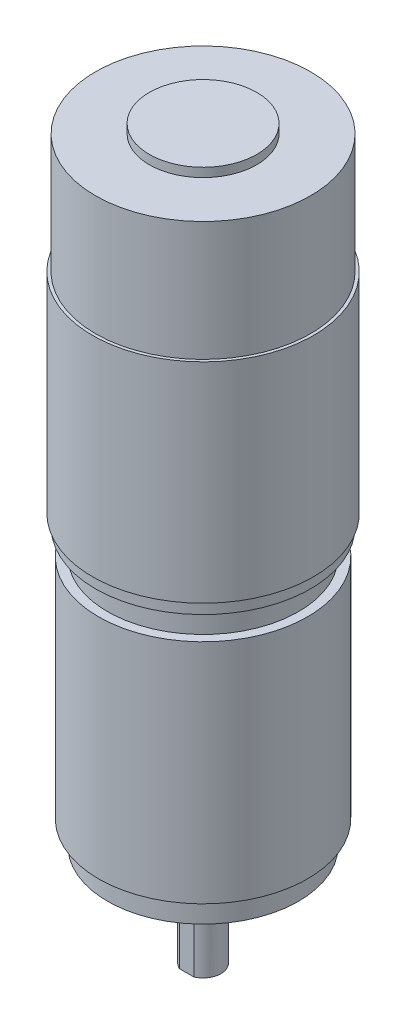
ISO-10303-21;
HEADER;
FILE_DESCRIPTION(('STEP AP214'),'2;1');
FILE_NAME('part.step','',(''),(''),'','','');
FILE_SCHEMA(('AUTOMOTIVE_DESIGN { 1 0 10303 214 1 1 1 1 }'));
ENDSEC;
DATA;
#1=APPLICATION_CONTEXT('core data for automotive mechanical design processes');
#2=APPLICATION_PROTOCOL_DEFINITION('international standard','automotive_design',2000,#1);
#3=PRODUCT_CONTEXT('',#1,'mechanical');
#4=PRODUCT('Part','Part','',(#3));
#5=PRODUCT_RELATED_PRODUCT_CATEGORY('part','',(#4));
#6=PRODUCT_DEFINITION_FORMATION('','',#4);
#7=PRODUCT_DEFINITION_CONTEXT('part definition',#1,'design');
#8=PRODUCT_DEFINITION('design','',#6,#7);
#9=PRODUCT_DEFINITION_SHAPE('','',#8);
#10=(LENGTH_UNIT() NAMED_UNIT(*) SI_UNIT(.MILLI.,.METRE.));
#11=(NAMED_UNIT(*) PLANE_ANGLE_UNIT() SI_UNIT($,.RADIAN.));
#12=(NAMED_UNIT(*) SI_UNIT($,.STERADIAN.) SOLID_ANGLE_UNIT());
#13=UNCERTAINTY_MEASURE_WITH_UNIT(LENGTH_MEASURE(1.E-05),#10,'distance_accuracy_value','');
#14=(GEOMETRIC_REPRESENTATION_CONTEXT(3) GLOBAL_UNCERTAINTY_ASSIGNED_CONTEXT((#13)) GLOBAL_UNIT_ASSIGNED_CONTEXT((#10,
#11,#12)) REPRESENTATION_CONTEXT('',''));
#15=CARTESIAN_POINT('',(0.,0.,0.));
#16=DIRECTION('',(0.,0.,1.));
#17=DIRECTION('',(1.,0.,0.));
#18=AXIS2_PLACEMENT_3D('',#15,#16,#17);
#19=CARTESIAN_POINT('',(-2.99999999999999,-121.8,0.));
#20=DIRECTION('',(0.,1.,0.));
#21=DIRECTION('',(0.,0.,1.));
#22=AXIS2_PLACEMENT_3D('',#19,#20,#21);
#23=PLANE('',#22);
#24=DIRECTION('',(1.,0.,0.));
#25=VECTOR('',#24,1.);
#26=CARTESIAN_POINT('',(-2.99999999999999,-121.8,-2.75));
#27=LINE('',#26,#25);
#28=CARTESIAN_POINT('',(-1.19895788082815,-121.8,-2.75));
#29=VERTEX_POINT('',#28);
#30=CARTESIAN_POINT('',(1.19895788082815,-121.8,-2.75));
#31=VERTEX_POINT('',#30);
#32=EDGE_CURVE('E94',#29,#31,#27,.T.);
#33=ORIENTED_EDGE('',*,*,#32,.T.);
#34=CARTESIAN_POINT('',(0.,-121.8,0.));
#35=DIRECTION('',(0.,-1.,0.));
#36=DIRECTION('',(0.,0.,-1.));
#37=AXIS2_PLACEMENT_3D('',#34,#35,#36);
#38=CIRCLE('',#37,2.99999999999999);
#39=CARTESIAN_POINT('',(1.19895788082815,-121.8,2.75));
#40=VERTEX_POINT('',#39);
#41=EDGE_CURVE('E60',#31,#40,#38,.T.);
#42=ORIENTED_EDGE('',*,*,#41,.T.);
#43=DIRECTION('',(-1.,0.,0.));
#44=VECTOR('',#43,1.);
#45=CARTESIAN_POINT('',(-2.99999999999999,-121.8,2.75));
#46=LINE('',#45,#44);
#47=CARTESIAN_POINT('',(-1.19895788082815,-121.8,2.75));
#48=VERTEX_POINT('',#47);
#49=EDGE_CURVE('E83',#40,#48,#46,.T.);
#50=ORIENTED_EDGE('',*,*,#49,.T.);
#51=EDGE_CURVE('E55',#48,#29,#38,.T.);
#52=ORIENTED_EDGE('',*,*,#51,.T.);
#53=EDGE_LOOP('',(#33,#42,#50,#52));
#54=FACE_BOUND('',#53,.T.);
#55=ADVANCED_FACE('F40',(#54),#23,.F.);
#56=CARTESIAN_POINT('',(0.,-180.909291234387,0.));
#57=DIRECTION('',(0.,-1.,0.));
#58=DIRECTION('',(0.,0.,-1.));
#59=AXIS2_PLACEMENT_3D('',#56,#57,#58);
#60=CYLINDRICAL_SURFACE('',#59,2.99999999999999);
#61=DIRECTION('',(0.,-1.,0.));
#62=VECTOR('',#61,1.);
#63=CARTESIAN_POINT('',(1.19895788082815,-180.909291234387,2.75));
#64=LINE('',#63,#62);
#65=CARTESIAN_POINT('',(1.19895788082815,-109.8,2.75));
#66=VERTEX_POINT('',#65);
#67=EDGE_CURVE('E106',#40,#66,#64,.F.);
#68=ORIENTED_EDGE('',*,*,#67,.F.);
#69=ORIENTED_EDGE('',*,*,#41,.F.);
#70=DIRECTION('',(0.,-1.,0.));
#71=VECTOR('',#70,1.);
#72=CARTESIAN_POINT('',(1.19895788082815,-180.909291234387,-2.75));
#73=LINE('',#72,#71);
#74=CARTESIAN_POINT('',(1.19895788082815,-109.8,-2.75));
#75=VERTEX_POINT('',#74);
#76=EDGE_CURVE('E12',#75,#31,#73,.T.);
#77=ORIENTED_EDGE('',*,*,#76,.F.);
#78=CARTESIAN_POINT('',(0.,-109.8,0.));
#79=DIRECTION('',(0.,-1.,0.));
#80=DIRECTION('',(0.,0.,-1.));
#81=AXIS2_PLACEMENT_3D('',#78,#79,#80);
#82=CIRCLE('',#81,2.99999999999999);
#83=CARTESIAN_POINT('',(-1.19895788082815,-109.8,-2.75));
#84=VERTEX_POINT('',#83);
#85=EDGE_CURVE('E48',#84,#75,#82,.T.);
#86=ORIENTED_EDGE('',*,*,#85,.F.);
#87=DIRECTION('',(0.,-1.,0.));
#88=VECTOR('',#87,1.);
#89=CARTESIAN_POINT('',(-1.19895788082815,-180.909291234387,-2.75));
#90=LINE('',#89,#88);
#91=EDGE_CURVE('E90',#29,#84,#90,.F.);
#92=ORIENTED_EDGE('',*,*,#91,.F.);
#93=ORIENTED_EDGE('',*,*,#51,.F.);
#94=DIRECTION('',(0.,-1.,0.));
#95=VECTOR('',#94,1.);
#96=CARTESIAN_POINT('',(-1.19895788082815,-180.909291234387,2.75));
#97=LINE('',#96,#95);
#98=CARTESIAN_POINT('',(-1.19895788082815,-109.8,2.75));
#99=VERTEX_POINT('',#98);
#100=EDGE_CURVE('E81',#99,#48,#97,.T.);
#101=ORIENTED_EDGE('',*,*,#100,.F.);
#102=EDGE_CURVE('E91',#66,#99,#82,.T.);
#103=ORIENTED_EDGE('',*,*,#102,.F.);
#104=EDGE_LOOP('',(#68,#69,#77,#86,#92,#93,#101,#103));
#105=FACE_BOUND('',#104,.T.);
#106=CARTESIAN_POINT('',(0.,-106.8,0.));
#107=DIRECTION('',(0.,-1.,0.));
#108=DIRECTION('',(0.,0.,-1.));
#109=AXIS2_PLACEMENT_3D('',#106,#107,#108);
#110=CIRCLE('',#109,2.99999999999999);
#111=CARTESIAN_POINT('',(0.,-106.8,-2.99999999999999));
#112=VERTEX_POINT('',#111);
#113=EDGE_CURVE('E102',#112,#112,#110,.T.);
#114=ORIENTED_EDGE('',*,*,#113,.T.);
#115=EDGE_LOOP('',(#114));
#116=FACE_BOUND('',#115,.T.);
#117=ADVANCED_FACE('F98',(#105,#116),#60,.T.);
#118=CARTESIAN_POINT('',(-10.,-106.8,0.));
#119=DIRECTION('',(0.,1.,0.));
#120=DIRECTION('',(0.,0.,1.));
#121=AXIS2_PLACEMENT_3D('',#118,#119,#120);
#122=PLANE('',#121);
#123=ORIENTED_EDGE('',*,*,#113,.F.);
#124=EDGE_LOOP('',(#123));
#125=FACE_BOUND('',#124,.T.);
#126=CARTESIAN_POINT('',(0.,-106.8,0.));
#127=DIRECTION('',(0.,-1.,0.));
#128=DIRECTION('',(0.,0.,-1.));
#129=AXIS2_PLACEMENT_3D('',#126,#127,#128);
#130=CIRCLE('',#129,10.);
#131=CARTESIAN_POINT('',(0.,-106.8,-10.));
#132=VERTEX_POINT('',#131);
#133=EDGE_CURVE('E108',#132,#132,#130,.T.);
#134=ORIENTED_EDGE('',*,*,#133,.T.);
#135=EDGE_LOOP('',(#134));
#136=FACE_BOUND('',#135,.T.);
#137=ADVANCED_FACE('F200',(#125,#136),#122,.F.);
#138=CARTESIAN_POINT('',(0.,-180.909291234387,0.));
#139=DIRECTION('',(0.,-1.,0.));
#140=DIRECTION('',(0.,0.,-1.));
#141=AXIS2_PLACEMENT_3D('',#138,#139,#140);
#142=CYLINDRICAL_SURFACE('',#141,10.);
#143=ORIENTED_EDGE('',*,*,#133,.F.);
#144=EDGE_LOOP('',(#143));
#145=FACE_BOUND('',#144,.T.);
#146=CARTESIAN_POINT('',(0.,-104.8,0.));
#147=DIRECTION('',(0.,-1.,0.));
#148=DIRECTION('',(0.,0.,-1.));
#149=AXIS2_PLACEMENT_3D('',#146,#147,#148);
#150=CIRCLE('',#149,10.);
#151=CARTESIAN_POINT('',(0.,-104.8,-10.));
#152=VERTEX_POINT('',#151);
#153=EDGE_CURVE('E193',#152,#152,#150,.T.);
#154=ORIENTED_EDGE('',*,*,#153,.T.);
#155=EDGE_LOOP('',(#154));
#156=FACE_BOUND('',#155,.T.);
#157=ADVANCED_FACE('F202',(#145,#156),#142,.T.);
#158=CARTESIAN_POINT('',(-16.,-104.8,0.));
#159=DIRECTION('',(0.,1.,0.));
#160=DIRECTION('',(0.,0.,1.));
#161=AXIS2_PLACEMENT_3D('',#158,#159,#160);
#162=PLANE('',#161);
#163=CARTESIAN_POINT('',(-9.,-104.8,-9.));
#164=DIRECTION('',(0.,-1.,0.));
#165=DIRECTION('',(0.,0.,-1.));
#166=AXIS2_PLACEMENT_3D('',#163,#164,#165);
#167=CIRCLE('',#166,1.5);
#168=CARTESIAN_POINT('',(-9.,-104.8,-10.5));
#169=VERTEX_POINT('',#168);
#170=EDGE_CURVE('E502',#169,#169,#167,.T.);
#171=ORIENTED_EDGE('',*,*,#170,.F.);
#172=EDGE_LOOP('',(#171));
#173=FACE_BOUND('',#172,.T.);
#174=CARTESIAN_POINT('',(9.,-104.8,-9.));
#175=DIRECTION('',(0.,-1.,0.));
#176=DIRECTION('',(0.,0.,-1.));
#177=AXIS2_PLACEMENT_3D('',#174,#175,#176);
#178=CIRCLE('',#177,1.5);
#179=CARTESIAN_POINT('',(9.,-104.8,-10.5));
#180=VERTEX_POINT('',#179);
#181=EDGE_CURVE('E501',#180,#180,#178,.T.);
#182=ORIENTED_EDGE('',*,*,#181,.F.);
#183=EDGE_LOOP('',(#182));
#184=FACE_BOUND('',#183,.T.);
#185=CARTESIAN_POINT('',(9.,-104.8,9.));
#186=DIRECTION('',(0.,-1.,0.));
#187=DIRECTION('',(0.,0.,-1.));
#188=AXIS2_PLACEMENT_3D('',#185,#186,#187);
#189=CIRCLE('',#188,1.5);
#190=CARTESIAN_POINT('',(9.,-104.8,7.5));
#191=VERTEX_POINT('',#190);
#192=EDGE_CURVE('E522',#191,#191,#189,.T.);
#193=ORIENTED_EDGE('',*,*,#192,.F.);
#194=EDGE_LOOP('',(#193));
#195=FACE_BOUND('',#194,.T.);
#196=CARTESIAN_POINT('',(-9.,-104.8,9.));
#197=DIRECTION('',(0.,-1.,0.));
#198=DIRECTION('',(0.,0.,-1.));
#199=AXIS2_PLACEMENT_3D('',#196,#197,#198);
#200=CIRCLE('',#199,1.5);
#201=CARTESIAN_POINT('',(-9.,-104.8,7.5));
#202=VERTEX_POINT('',#201);
#203=EDGE_CURVE('E135',#202,#202,#200,.T.);
#204=ORIENTED_EDGE('',*,*,#203,.F.);
#205=EDGE_LOOP('',(#204));
#206=FACE_BOUND('',#205,.T.);
#207=ORIENTED_EDGE('',*,*,#153,.F.);
#208=EDGE_LOOP('',(#207));
#209=FACE_BOUND('',#208,.T.);
#210=CARTESIAN_POINT('',(0.,-104.8,0.));
#211=DIRECTION('',(0.,-1.,0.));
#212=DIRECTION('',(0.,0.,-1.));
#213=AXIS2_PLACEMENT_3D('',#210,#211,#212);
#214=CIRCLE('',#213,16.);
#215=CARTESIAN_POINT('',(0.,-104.8,-16.));
#216=VERTEX_POINT('',#215);
#217=EDGE_CURVE('E189',#216,#216,#214,.T.);
#218=ORIENTED_EDGE('',*,*,#217,.T.);
#219=EDGE_LOOP('',(#218));
#220=FACE_BOUND('',#219,.T.);
#221=ADVANCED_FACE('F205',(#173,#184,#195,#206,#209,#220),#162,.F.);
#222=CARTESIAN_POINT('',(0.,-180.909291234387,0.));
#223=DIRECTION('',(0.,-1.,0.));
#224=DIRECTION('',(0.,0.,-1.));
#225=AXIS2_PLACEMENT_3D('',#222,#223,#224);
#226=CYLINDRICAL_SURFACE('',#225,16.);
#227=ORIENTED_EDGE('',*,*,#217,.F.);
#228=EDGE_LOOP('',(#227));
#229=FACE_BOUND('',#228,.T.);
#230=CARTESIAN_POINT('',(0.,-100.8,0.));
#231=DIRECTION('',(0.,-1.,0.));
#232=DIRECTION('',(0.,0.,-1.));
#233=AXIS2_PLACEMENT_3D('',#230,#231,#232);
#234=CIRCLE('',#233,16.);
#235=CARTESIAN_POINT('',(0.,-100.8,-16.));
#236=VERTEX_POINT('',#235);
#237=EDGE_CURVE('E185',#236,#236,#234,.T.);
#238=ORIENTED_EDGE('',*,*,#237,.T.);
#239=EDGE_LOOP('',(#238));
#240=FACE_BOUND('',#239,.T.);
#241=ADVANCED_FACE('F211',(#229,#240),#226,.T.);
#242=CARTESIAN_POINT('',(-17.5,-100.8,0.));
#243=DIRECTION('',(0.,1.,0.));
#244=DIRECTION('',(0.,0.,1.));
#245=AXIS2_PLACEMENT_3D('',#242,#243,#244);
#246=PLANE('',#245);
#247=ORIENTED_EDGE('',*,*,#237,.F.);
#248=EDGE_LOOP('',(#247));
#249=FACE_BOUND('',#248,.T.);
#250=CARTESIAN_POINT('',(0.,-100.8,0.));
#251=DIRECTION('',(0.,-1.,0.));
#252=DIRECTION('',(0.,0.,-1.));
#253=AXIS2_PLACEMENT_3D('',#250,#251,#252);
#254=CIRCLE('',#253,17.5);
#255=CARTESIAN_POINT('',(0.,-100.8,-17.5));
#256=VERTEX_POINT('',#255);
#257=EDGE_CURVE('E181',#256,#256,#254,.T.);
#258=ORIENTED_EDGE('',*,*,#257,.T.);
#259=EDGE_LOOP('',(#258));
#260=FACE_BOUND('',#259,.T.);
#261=ADVANCED_FACE('F218',(#249,#260),#246,.F.);
#262=CARTESIAN_POINT('',(0.,-180.909291234387,0.));
#263=DIRECTION('',(0.,-1.,0.));
#264=DIRECTION('',(0.,0.,-1.));
#265=AXIS2_PLACEMENT_3D('',#262,#263,#264);
#266=CYLINDRICAL_SURFACE('',#265,17.5);
#267=ORIENTED_EDGE('',*,*,#257,.F.);
#268=EDGE_LOOP('',(#267));
#269=FACE_BOUND('',#268,.T.);
#270=CARTESIAN_POINT('',(0.,-62.8,0.));
#271=DIRECTION('',(0.,-1.,0.));
#272=DIRECTION('',(0.,0.,-1.));
#273=AXIS2_PLACEMENT_3D('',#270,#271,#272);
#274=CIRCLE('',#273,17.5);
#275=CARTESIAN_POINT('',(0.,-62.8,-17.5));
#276=VERTEX_POINT('',#275);
#277=EDGE_CURVE('E177',#276,#276,#274,.T.);
#278=ORIENTED_EDGE('',*,*,#277,.T.);
#279=EDGE_LOOP('',(#278));
#280=FACE_BOUND('',#279,.T.);
#281=ADVANCED_FACE('F224',(#269,#280),#266,.T.);
#282=CARTESIAN_POINT('',(-16.,-62.8,0.));
#283=DIRECTION('',(0.,-1.,0.));
#284=DIRECTION('',(0.,0.,-1.));
#285=AXIS2_PLACEMENT_3D('',#282,#283,#284);
#286=PLANE('',#285);
#287=ORIENTED_EDGE('',*,*,#277,.F.);
#288=EDGE_LOOP('',(#287));
#289=FACE_BOUND('',#288,.T.);
#290=CARTESIAN_POINT('',(0.,-62.8,0.));
#291=DIRECTION('',(0.,-1.,0.));
#292=DIRECTION('',(0.,0.,-1.));
#293=AXIS2_PLACEMENT_3D('',#290,#291,#292);
#294=CIRCLE('',#293,16.);
#295=CARTESIAN_POINT('',(0.,-62.8,-16.));
#296=VERTEX_POINT('',#295);
#297=EDGE_CURVE('E173',#296,#296,#294,.T.);
#298=ORIENTED_EDGE('',*,*,#297,.T.);
#299=EDGE_LOOP('',(#298));
#300=FACE_BOUND('',#299,.T.);
#301=ADVANCED_FACE('F230',(#289,#300),#286,.F.);
#302=CARTESIAN_POINT('',(0.,-180.909291234387,0.));
#303=DIRECTION('',(0.,-1.,0.));
#304=DIRECTION('',(0.,0.,-1.));
#305=AXIS2_PLACEMENT_3D('',#302,#303,#304);
#306=CYLINDRICAL_SURFACE('',#305,16.);
#307=ORIENTED_EDGE('',*,*,#297,.F.);
#308=EDGE_LOOP('',(#307));
#309=FACE_BOUND('',#308,.T.);
#310=CARTESIAN_POINT('',(0.,-58.5,0.));
#311=DIRECTION('',(0.,-1.,0.));
#312=DIRECTION('',(0.,0.,-1.));
#313=AXIS2_PLACEMENT_3D('',#310,#311,#312);
#314=CIRCLE('',#313,16.);
#315=CARTESIAN_POINT('',(0.,-58.5,-16.));
#316=VERTEX_POINT('',#315);
#317=EDGE_CURVE('E169',#316,#316,#314,.T.);
#318=ORIENTED_EDGE('',*,*,#317,.T.);
#319=EDGE_LOOP('',(#318));
#320=FACE_BOUND('',#319,.T.);
#321=ADVANCED_FACE('F236',(#309,#320),#306,.T.);
#322=CARTESIAN_POINT('',(-18.,-58.5,0.));
#323=DIRECTION('',(0.,1.,0.));
#324=DIRECTION('',(0.,0.,1.));
#325=AXIS2_PLACEMENT_3D('',#322,#323,#324);
#326=PLANE('',#325);
#327=ORIENTED_EDGE('',*,*,#317,.F.);
#328=EDGE_LOOP('',(#327));
#329=FACE_BOUND('',#328,.T.);
#330=CARTESIAN_POINT('',(0.,-58.5,0.));
#331=DIRECTION('',(0.,-1.,0.));
#332=DIRECTION('',(0.,0.,-1.));
#333=AXIS2_PLACEMENT_3D('',#330,#331,#332);
#334=CIRCLE('',#333,18.);
#335=CARTESIAN_POINT('',(0.,-58.5,-18.));
#336=VERTEX_POINT('',#335);
#337=EDGE_CURVE('E165',#336,#336,#334,.T.);
#338=ORIENTED_EDGE('',*,*,#337,.T.);
#339=EDGE_LOOP('',(#338));
#340=FACE_BOUND('',#339,.T.);
#341=ADVANCED_FACE('F242',(#329,#340),#326,.F.);
#342=CARTESIAN_POINT('',(0.,-180.909291234387,0.));
#343=DIRECTION('',(0.,-1.,0.));
#344=DIRECTION('',(0.,0.,-1.));
#345=AXIS2_PLACEMENT_3D('',#342,#343,#344);
#346=CYLINDRICAL_SURFACE('',#345,18.);
#347=ORIENTED_EDGE('',*,*,#337,.F.);
#348=EDGE_LOOP('',(#347));
#349=FACE_BOUND('',#348,.T.);
#350=CARTESIAN_POINT('',(0.,-56.5,0.));
#351=DIRECTION('',(0.,-1.,0.));
#352=DIRECTION('',(0.,0.,-1.));
#353=AXIS2_PLACEMENT_3D('',#350,#351,#352);
#354=CIRCLE('',#353,18.);
#355=CARTESIAN_POINT('',(0.,-56.5,-18.));
#356=VERTEX_POINT('',#355);
#357=EDGE_CURVE('E161',#356,#356,#354,.T.);
#358=ORIENTED_EDGE('',*,*,#357,.T.);
#359=EDGE_LOOP('',(#358));
#360=FACE_BOUND('',#359,.T.);
#361=ADVANCED_FACE('F248',(#349,#360),#346,.T.);
#362=CARTESIAN_POINT('',(-18.5,-56.5,0.));
#363=DIRECTION('',(0.,1.,0.));
#364=DIRECTION('',(0.,0.,1.));
#365=AXIS2_PLACEMENT_3D('',#362,#363,#364);
#366=PLANE('',#365);
#367=ORIENTED_EDGE('',*,*,#357,.F.);
#368=EDGE_LOOP('',(#367));
#369=FACE_BOUND('',#368,.T.);
#370=CARTESIAN_POINT('',(0.,-56.5,0.));
#371=DIRECTION('',(0.,-1.,0.));
#372=DIRECTION('',(0.,0.,-1.));
#373=AXIS2_PLACEMENT_3D('',#370,#371,#372);
#374=CIRCLE('',#373,18.5);
#375=CARTESIAN_POINT('',(0.,-56.5,-18.5));
#376=VERTEX_POINT('',#375);
#377=EDGE_CURVE('E157',#376,#376,#374,.T.);
#378=ORIENTED_EDGE('',*,*,#377,.T.);
#379=EDGE_LOOP('',(#378));
#380=FACE_BOUND('',#379,.T.);
#381=ADVANCED_FACE('F254',(#369,#380),#366,.F.);
#382=CARTESIAN_POINT('',(0.,-180.909291234387,0.));
#383=DIRECTION('',(0.,-1.,0.));
#384=DIRECTION('',(0.,0.,-1.));
#385=AXIS2_PLACEMENT_3D('',#382,#383,#384);
#386=CYLINDRICAL_SURFACE('',#385,18.5);
#387=ORIENTED_EDGE('',*,*,#377,.F.);
#388=EDGE_LOOP('',(#387));
#389=FACE_BOUND('',#388,.T.);
#390=CARTESIAN_POINT('',(0.,-21.5,0.));
#391=DIRECTION('',(0.,-1.,0.));
#392=DIRECTION('',(0.,0.,-1.));
#393=AXIS2_PLACEMENT_3D('',#390,#391,#392);
#394=CIRCLE('',#393,18.5);
#395=CARTESIAN_POINT('',(0.,-21.5,-18.5));
#396=VERTEX_POINT('',#395);
#397=EDGE_CURVE('E153',#396,#396,#394,.T.);
#398=ORIENTED_EDGE('',*,*,#397,.T.);
#399=EDGE_LOOP('',(#398));
#400=FACE_BOUND('',#399,.T.);
#401=ADVANCED_FACE('F260',(#389,#400),#386,.T.);
#402=CARTESIAN_POINT('',(-18.,-21.5,0.));
#403=DIRECTION('',(0.,-1.,0.));
#404=DIRECTION('',(0.,0.,-1.));
#405=AXIS2_PLACEMENT_3D('',#402,#403,#404);
#406=PLANE('',#405);
#407=ORIENTED_EDGE('',*,*,#397,.F.);
#408=EDGE_LOOP('',(#407));
#409=FACE_BOUND('',#408,.T.);
#410=CARTESIAN_POINT('',(0.,-21.5,0.));
#411=DIRECTION('',(0.,-1.,0.));
#412=DIRECTION('',(0.,0.,-1.));
#413=AXIS2_PLACEMENT_3D('',#410,#411,#412);
#414=CIRCLE('',#413,18.);
#415=CARTESIAN_POINT('',(0.,-21.5,-18.));
#416=VERTEX_POINT('',#415);
#417=EDGE_CURVE('E149',#416,#416,#414,.T.);
#418=ORIENTED_EDGE('',*,*,#417,.T.);
#419=EDGE_LOOP('',(#418));
#420=FACE_BOUND('',#419,.T.);
#421=ADVANCED_FACE('F266',(#409,#420),#406,.F.);
#422=CARTESIAN_POINT('',(0.,-180.909291234387,0.));
#423=DIRECTION('',(0.,-1.,0.));
#424=DIRECTION('',(0.,0.,-1.));
#425=AXIS2_PLACEMENT_3D('',#422,#423,#424);
#426=CYLINDRICAL_SURFACE('',#425,18.);
#427=ORIENTED_EDGE('',*,*,#417,.F.);
#428=EDGE_LOOP('',(#427));
#429=FACE_BOUND('',#428,.T.);
#430=CARTESIAN_POINT('',(0.,-1.5,0.));
#431=DIRECTION('',(0.,-1.,0.));
#432=DIRECTION('',(0.,0.,-1.));
#433=AXIS2_PLACEMENT_3D('',#430,#431,#432);
#434=CIRCLE('',#433,18.);
#435=CARTESIAN_POINT('',(0.,-1.5,-18.));
#436=VERTEX_POINT('',#435);
#437=EDGE_CURVE('E145',#436,#436,#434,.T.);
#438=ORIENTED_EDGE('',*,*,#437,.T.);
#439=EDGE_LOOP('',(#438));
#440=FACE_BOUND('',#439,.T.);
#441=ADVANCED_FACE('F272',(#429,#440),#426,.T.);
#442=CARTESIAN_POINT('',(-9.,-1.5,0.));
#443=DIRECTION('',(0.,-1.,0.));
#444=DIRECTION('',(0.,0.,-1.));
#445=AXIS2_PLACEMENT_3D('',#442,#443,#444);
#446=PLANE('',#445);
#447=ORIENTED_EDGE('',*,*,#437,.F.);
#448=EDGE_LOOP('',(#447));
#449=FACE_BOUND('',#448,.T.);
#450=CARTESIAN_POINT('',(0.,-1.5,0.));
#451=DIRECTION('',(0.,-1.,0.));
#452=DIRECTION('',(0.,0.,-1.));
#453=AXIS2_PLACEMENT_3D('',#450,#451,#452);
#454=CIRCLE('',#453,9.);
#455=CARTESIAN_POINT('',(0.,-1.5,-9.));
#456=VERTEX_POINT('',#455);
#457=EDGE_CURVE('E141',#456,#456,#454,.T.);
#458=ORIENTED_EDGE('',*,*,#457,.T.);
#459=EDGE_LOOP('',(#458));
#460=FACE_BOUND('',#459,.T.);
#461=ADVANCED_FACE('F278',(#449,#460),#446,.F.);
#462=CARTESIAN_POINT('',(0.,-180.909291234387,0.));
#463=DIRECTION('',(0.,-1.,0.));
#464=DIRECTION('',(0.,0.,-1.));
#465=AXIS2_PLACEMENT_3D('',#462,#463,#464);
#466=CYLINDRICAL_SURFACE('',#465,9.);
#467=ORIENTED_EDGE('',*,*,#457,.F.);
#468=EDGE_LOOP('',(#467));
#469=FACE_BOUND('',#468,.T.);
#470=CARTESIAN_POINT('',(0.,0.,0.));
#471=DIRECTION('',(0.,-1.,0.));
#472=DIRECTION('',(0.,0.,-1.));
#473=AXIS2_PLACEMENT_3D('',#470,#471,#472);
#474=CIRCLE('',#473,9.);
#475=CARTESIAN_POINT('',(0.,0.,-9.));
#476=VERTEX_POINT('',#475);
#477=EDGE_CURVE('E126',#476,#476,#474,.T.);
#478=ORIENTED_EDGE('',*,*,#477,.T.);
#479=EDGE_LOOP('',(#478));
#480=FACE_BOUND('',#479,.T.);
#481=ADVANCED_FACE('F284',(#469,#480),#466,.T.);
#482=CARTESIAN_POINT('',(0.,0.,0.));
#483=DIRECTION('',(0.,-1.,0.));
#484=DIRECTION('',(0.,0.,-1.));
#485=AXIS2_PLACEMENT_3D('',#482,#483,#484);
#486=PLANE('',#485);
#487=ORIENTED_EDGE('',*,*,#477,.F.);
#488=EDGE_LOOP('',(#487));
#489=FACE_BOUND('',#488,.T.);
#490=ADVANCED_FACE('F290',(#489),#486,.F.);
#491=CARTESIAN_POINT('',(-2.99999999999999,-109.8,2.75));
#492=DIRECTION('',(0.,0.,1.));
#493=DIRECTION('',(1.,0.,0.));
#494=AXIS2_PLACEMENT_3D('',#491,#492,#493);
#495=PLANE('',#494);
#496=ORIENTED_EDGE('',*,*,#100,.T.);
#497=ORIENTED_EDGE('',*,*,#49,.F.);
#498=ORIENTED_EDGE('',*,*,#67,.T.);
#499=DIRECTION('',(-1.,0.,0.));
#500=VECTOR('',#499,1.);
#501=CARTESIAN_POINT('',(-2.99999999999999,-109.8,2.75));
#502=LINE('',#501,#500);
#503=EDGE_CURVE('E86',#66,#99,#502,.T.);
#504=ORIENTED_EDGE('',*,*,#503,.T.);
#505=EDGE_LOOP('',(#496,#497,#498,#504));
#506=FACE_BOUND('',#505,.T.);
#507=ADVANCED_FACE('F82',(#506),#495,.T.);
#508=CARTESIAN_POINT('',(0.,-109.8,0.));
#509=DIRECTION('',(0.,-1.,0.));
#510=DIRECTION('',(0.,0.,-1.));
#511=AXIS2_PLACEMENT_3D('',#508,#509,#510);
#512=PLANE('',#511);
#513=ORIENTED_EDGE('',*,*,#102,.T.);
#514=ORIENTED_EDGE('',*,*,#503,.F.);
#515=EDGE_LOOP('',(#513,#514));
#516=FACE_BOUND('',#515,.T.);
#517=ADVANCED_FACE('F129',(#516),#512,.T.);
#518=ORIENTED_EDGE('',*,*,#85,.T.);
#519=DIRECTION('',(1.,0.,0.));
#520=VECTOR('',#519,1.);
#521=CARTESIAN_POINT('',(-2.99999999999999,-109.8,-2.75));
#522=LINE('',#521,#520);
#523=EDGE_CURVE('E122',#84,#75,#522,.T.);
#524=ORIENTED_EDGE('',*,*,#523,.F.);
#525=EDGE_LOOP('',(#518,#524));
#526=FACE_BOUND('',#525,.T.);
#527=ADVANCED_FACE('F121',(#526),#512,.T.);
#528=CARTESIAN_POINT('',(-2.99999999999999,-109.8,-2.75));
#529=DIRECTION('',(0.,0.,-1.));
#530=DIRECTION('',(-1.,0.,0.));
#531=AXIS2_PLACEMENT_3D('',#528,#529,#530);
#532=PLANE('',#531);
#533=ORIENTED_EDGE('',*,*,#76,.T.);
#534=ORIENTED_EDGE('',*,*,#32,.F.);
#535=ORIENTED_EDGE('',*,*,#91,.T.);
#536=ORIENTED_EDGE('',*,*,#523,.T.);
#537=EDGE_LOOP('',(#533,#534,#535,#536));
#538=FACE_BOUND('',#537,.T.);
#539=ADVANCED_FACE('F124',(#538),#532,.T.);
#540=CARTESIAN_POINT('',(-9.,-99.8,9.));
#541=DIRECTION('',(0.,-1.,0.));
#542=DIRECTION('',(0.,0.,-1.));
#543=AXIS2_PLACEMENT_3D('',#540,#541,#542);
#544=CYLINDRICAL_SURFACE('',#543,1.5);
#545=CARTESIAN_POINT('',(-9.,-99.8,9.));
#546=DIRECTION('',(0.,-1.,0.));
#547=DIRECTION('',(0.,0.,-1.));
#548=AXIS2_PLACEMENT_3D('',#545,#546,#547);
#549=CIRCLE('',#548,1.5);
#550=CARTESIAN_POINT('',(-9.,-99.8,7.5));
#551=VERTEX_POINT('',#550);
#552=EDGE_CURVE('E95',#551,#551,#549,.T.);
#553=ORIENTED_EDGE('',*,*,#552,.F.);
#554=EDGE_LOOP('',(#553));
#555=FACE_BOUND('',#554,.T.);
#556=ORIENTED_EDGE('',*,*,#203,.T.);
#557=EDGE_LOOP('',(#556));
#558=FACE_BOUND('',#557,.T.);
#559=ADVANCED_FACE('F414',(#555,#558),#544,.F.);
#560=CARTESIAN_POINT('',(-9.,-99.8,9.));
#561=DIRECTION('',(0.,-1.,0.));
#562=DIRECTION('',(0.,0.,-1.));
#563=AXIS2_PLACEMENT_3D('',#560,#561,#562);
#564=PLANE('',#563);
#565=ORIENTED_EDGE('',*,*,#552,.T.);
#566=EDGE_LOOP('',(#565));
#567=FACE_BOUND('',#566,.T.);
#568=ADVANCED_FACE('F423',(#567),#564,.T.);
#569=CARTESIAN_POINT('',(9.,-99.8,9.));
#570=DIRECTION('',(0.,-1.,0.));
#571=DIRECTION('',(0.,0.,-1.));
#572=AXIS2_PLACEMENT_3D('',#569,#570,#571);
#573=CYLINDRICAL_SURFACE('',#572,1.5);
#574=CARTESIAN_POINT('',(9.,-99.8,9.));
#575=DIRECTION('',(0.,-1.,0.));
#576=DIRECTION('',(0.,0.,-1.));
#577=AXIS2_PLACEMENT_3D('',#574,#575,#576);
#578=CIRCLE('',#577,1.5);
#579=CARTESIAN_POINT('',(9.,-99.8,7.5));
#580=VERTEX_POINT('',#579);
#581=EDGE_CURVE('E517',#580,#580,#578,.T.);
#582=ORIENTED_EDGE('',*,*,#581,.F.);
#583=EDGE_LOOP('',(#582));
#584=FACE_BOUND('',#583,.T.);
#585=ORIENTED_EDGE('',*,*,#192,.T.);
#586=EDGE_LOOP('',(#585));
#587=FACE_BOUND('',#586,.T.);
#588=ADVANCED_FACE('F430',(#584,#587),#573,.F.);
#589=CARTESIAN_POINT('',(9.,-99.8,9.));
#590=DIRECTION('',(0.,-1.,0.));
#591=DIRECTION('',(0.,0.,-1.));
#592=AXIS2_PLACEMENT_3D('',#589,#590,#591);
#593=PLANE('',#592);
#594=ORIENTED_EDGE('',*,*,#581,.T.);
#595=EDGE_LOOP('',(#594));
#596=FACE_BOUND('',#595,.T.);
#597=ADVANCED_FACE('F438',(#596),#593,.T.);
#598=CARTESIAN_POINT('',(9.,-99.8,-9.));
#599=DIRECTION('',(0.,-1.,0.));
#600=DIRECTION('',(0.,0.,-1.));
#601=AXIS2_PLACEMENT_3D('',#598,#599,#600);
#602=CYLINDRICAL_SURFACE('',#601,1.5);
#603=CARTESIAN_POINT('',(9.,-99.8,-9.));
#604=DIRECTION('',(0.,-1.,0.));
#605=DIRECTION('',(0.,0.,-1.));
#606=AXIS2_PLACEMENT_3D('',#603,#604,#605);
#607=CIRCLE('',#606,1.5);
#608=CARTESIAN_POINT('',(9.,-99.8,-10.5));
#609=VERTEX_POINT('',#608);
#610=EDGE_CURVE('E507',#609,#609,#607,.T.);
#611=ORIENTED_EDGE('',*,*,#610,.F.);
#612=EDGE_LOOP('',(#611));
#613=FACE_BOUND('',#612,.T.);
#614=ORIENTED_EDGE('',*,*,#181,.T.);
#615=EDGE_LOOP('',(#614));
#616=FACE_BOUND('',#615,.T.);
#617=ADVANCED_FACE('F446',(#613,#616),#602,.F.);
#618=CARTESIAN_POINT('',(9.,-99.8,-9.));
#619=DIRECTION('',(0.,-1.,0.));
#620=DIRECTION('',(0.,0.,-1.));
#621=AXIS2_PLACEMENT_3D('',#618,#619,#620);
#622=PLANE('',#621);
#623=ORIENTED_EDGE('',*,*,#610,.T.);
#624=EDGE_LOOP('',(#623));
#625=FACE_BOUND('',#624,.T.);
#626=ADVANCED_FACE('F454',(#625),#622,.T.);
#627=CARTESIAN_POINT('',(-9.,-99.8,-9.));
#628=DIRECTION('',(0.,-1.,0.));
#629=DIRECTION('',(0.,0.,-1.));
#630=AXIS2_PLACEMENT_3D('',#627,#628,#629);
#631=CYLINDRICAL_SURFACE('',#630,1.5);
#632=CARTESIAN_POINT('',(-9.,-99.8,-9.));
#633=DIRECTION('',(0.,-1.,0.));
#634=DIRECTION('',(0.,0.,-1.));
#635=AXIS2_PLACEMENT_3D('',#632,#633,#634);
#636=CIRCLE('',#635,1.5);
#637=CARTESIAN_POINT('',(-9.,-99.8,-10.5));
#638=VERTEX_POINT('',#637);
#639=EDGE_CURVE('E499',#638,#638,#636,.T.);
#640=ORIENTED_EDGE('',*,*,#639,.F.);
#641=EDGE_LOOP('',(#640));
#642=FACE_BOUND('',#641,.T.);
#643=ORIENTED_EDGE('',*,*,#170,.T.);
#644=EDGE_LOOP('',(#643));
#645=FACE_BOUND('',#644,.T.);
#646=ADVANCED_FACE('F462',(#642,#645),#631,.F.);
#647=CARTESIAN_POINT('',(-9.,-99.8,-9.));
#648=DIRECTION('',(0.,-1.,0.));
#649=DIRECTION('',(0.,0.,-1.));
#650=AXIS2_PLACEMENT_3D('',#647,#648,#649);
#651=PLANE('',#650);
#652=ORIENTED_EDGE('',*,*,#639,.T.);
#653=EDGE_LOOP('',(#652));
#654=FACE_BOUND('',#653,.T.);
#655=ADVANCED_FACE('F470',(#654),#651,.T.);
#656=CLOSED_SHELL('',(#55,#117,#137,#157,#221,#241,#261,#281,#301,#321,#341,#361,#381,#401,#421,
#441,#461,#481,#490,#507,#517,#527,#539,#559,#568,#588,#597,#617,#626,#646,#655));
#657=MANIFOLD_SOLID_BREP('B2',#656);
#658=ADVANCED_BREP_SHAPE_REPRESENTATION('',(#18,#657),#14);
#659=SHAPE_DEFINITION_REPRESENTATION(#9,#658);
ENDSEC;
END-ISO-10303-21;
